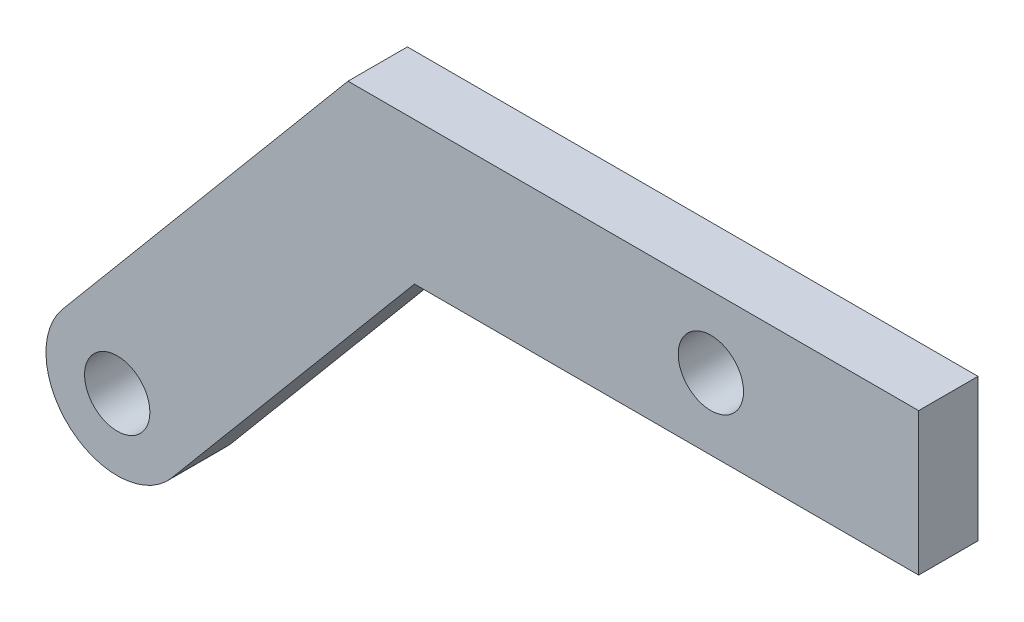
ISO-10303-21;
HEADER;
FILE_DESCRIPTION(('STEP AP214'),'2;1');
FILE_NAME('part.step','',(''),(''),'','','');
FILE_SCHEMA(('AUTOMOTIVE_DESIGN { 1 0 10303 214 1 1 1 1 }'));
ENDSEC;
DATA;
#1=APPLICATION_CONTEXT('core data for automotive mechanical design processes');
#2=APPLICATION_PROTOCOL_DEFINITION('international standard','automotive_design',2000,#1);
#3=PRODUCT_CONTEXT('',#1,'mechanical');
#4=PRODUCT('Part','Part','',(#3));
#5=PRODUCT_RELATED_PRODUCT_CATEGORY('part','',(#4));
#6=PRODUCT_DEFINITION_FORMATION('','',#4);
#7=PRODUCT_DEFINITION_CONTEXT('part definition',#1,'design');
#8=PRODUCT_DEFINITION('design','',#6,#7);
#9=PRODUCT_DEFINITION_SHAPE('','',#8);
#10=(LENGTH_UNIT() NAMED_UNIT(*) SI_UNIT(.MILLI.,.METRE.));
#11=(NAMED_UNIT(*) PLANE_ANGLE_UNIT() SI_UNIT($,.RADIAN.));
#12=(NAMED_UNIT(*) SI_UNIT($,.STERADIAN.) SOLID_ANGLE_UNIT());
#13=UNCERTAINTY_MEASURE_WITH_UNIT(LENGTH_MEASURE(1.E-05),#10,'distance_accuracy_value','');
#14=(GEOMETRIC_REPRESENTATION_CONTEXT(3) GLOBAL_UNCERTAINTY_ASSIGNED_CONTEXT((#13)) GLOBAL_UNIT_ASSIGNED_CONTEXT((#10,
#11,#12)) REPRESENTATION_CONTEXT('',''));
#15=CARTESIAN_POINT('',(0.,0.,0.));
#16=DIRECTION('',(0.,0.,1.));
#17=DIRECTION('',(1.,0.,0.));
#18=AXIS2_PLACEMENT_3D('',#15,#16,#17);
#19=CARTESIAN_POINT('',(0.,0.,10.));
#20=DIRECTION('',(0.,0.,1.));
#21=DIRECTION('',(1.,0.,0.));
#22=AXIS2_PLACEMENT_3D('',#19,#20,#21);
#23=PLANE('',#22);
#24=CARTESIAN_POINT('',(0.,0.,10.));
#25=DIRECTION('',(0.,0.,1.));
#26=DIRECTION('',(1.,0.,0.));
#27=AXIS2_PLACEMENT_3D('',#24,#25,#26);
#28=CIRCLE('',#27,5.5);
#29=CARTESIAN_POINT('',(5.5,0.,10.));
#30=VERTEX_POINT('',#29);
#31=EDGE_CURVE('E138',#30,#30,#28,.T.);
#32=ORIENTED_EDGE('',*,*,#31,.F.);
#33=EDGE_LOOP('',(#32));
#34=FACE_BOUND('',#33,.T.);
#35=CARTESIAN_POINT('',(0.,0.,10.));
#36=DIRECTION('',(0.,0.,1.));
#37=DIRECTION('',(1.,0.,0.));
#38=AXIS2_PLACEMENT_3D('',#35,#36,#37);
#39=CIRCLE('',#38,12.);
#40=CARTESIAN_POINT('',(-9.19253331742769,7.71345131623852,10.));
#41=VERTEX_POINT('',#40);
#42=CARTESIAN_POINT('',(9.19253331742769,-7.71345131623852,10.));
#43=VERTEX_POINT('',#42);
#44=EDGE_CURVE('E155',#41,#43,#39,.T.);
#45=ORIENTED_EDGE('',*,*,#44,.T.);
#46=DIRECTION('',(0.642787609686543,0.766044443118975,0.));
#47=VECTOR('',#46,1.);
#48=CARTESIAN_POINT('',(50.0679723502562,41.,10.));
#49=LINE('',#48,#47);
#50=CARTESIAN_POINT('',(50.0679723502562,41.,10.));
#51=VERTEX_POINT('',#50);
#52=EDGE_CURVE('E99',#43,#51,#49,.T.);
#53=ORIENTED_EDGE('',*,*,#52,.T.);
#54=DIRECTION('',(1.,0.,0.));
#55=VECTOR('',#54,1.);
#56=CARTESIAN_POINT('',(135.,41.,10.));
#57=LINE('',#56,#55);
#58=CARTESIAN_POINT('',(135.,41.,10.));
#59=VERTEX_POINT('',#58);
#60=EDGE_CURVE('E114',#51,#59,#57,.T.);
#61=ORIENTED_EDGE('',*,*,#60,.T.);
#62=DIRECTION('',(0.,1.,0.));
#63=VECTOR('',#62,1.);
#64=CARTESIAN_POINT('',(135.,65.,10.));
#65=LINE('',#64,#63);
#66=CARTESIAN_POINT('',(135.,65.,10.));
#67=VERTEX_POINT('',#66);
#68=EDGE_CURVE('E110',#59,#67,#65,.T.);
#69=ORIENTED_EDGE('',*,*,#68,.T.);
#70=DIRECTION('',(-1.,0.,0.));
#71=VECTOR('',#70,1.);
#72=CARTESIAN_POINT('',(38.8765885545364,65.,10.));
#73=LINE('',#72,#71);
#74=CARTESIAN_POINT('',(38.8765885545364,65.,10.));
#75=VERTEX_POINT('',#74);
#76=EDGE_CURVE('E112',#67,#75,#73,.T.);
#77=ORIENTED_EDGE('',*,*,#76,.T.);
#78=DIRECTION('',(-0.642787609686543,-0.766044443118975,0.));
#79=VECTOR('',#78,1.);
#80=CARTESIAN_POINT('',(-9.19253331742769,7.71345131623852,10.));
#81=LINE('',#80,#79);
#82=EDGE_CURVE('E64',#75,#41,#81,.T.);
#83=ORIENTED_EDGE('',*,*,#82,.T.);
#84=EDGE_LOOP('',(#45,#53,#61,#69,#77,#83));
#85=FACE_BOUND('',#84,.T.);
#86=CARTESIAN_POINT('',(100.,53.,10.));
#87=DIRECTION('',(0.,0.,1.));
#88=DIRECTION('',(1.,0.,0.));
#89=AXIS2_PLACEMENT_3D('',#86,#87,#88);
#90=CIRCLE('',#89,5.5);
#91=CARTESIAN_POINT('',(105.5,53.,10.));
#92=VERTEX_POINT('',#91);
#93=EDGE_CURVE('E196',#92,#92,#90,.T.);
#94=ORIENTED_EDGE('',*,*,#93,.F.);
#95=EDGE_LOOP('',(#94));
#96=FACE_BOUND('',#95,.T.);
#97=ADVANCED_FACE('F44',(#34,#85,#96),#23,.T.);
#98=CARTESIAN_POINT('',(0.,0.,0.));
#99=DIRECTION('',(0.,0.,1.));
#100=DIRECTION('',(1.,0.,0.));
#101=AXIS2_PLACEMENT_3D('',#98,#99,#100);
#102=PLANE('',#101);
#103=CARTESIAN_POINT('',(0.,0.,0.));
#104=DIRECTION('',(0.,0.,1.));
#105=DIRECTION('',(1.,0.,0.));
#106=AXIS2_PLACEMENT_3D('',#103,#104,#105);
#107=CIRCLE('',#106,12.);
#108=CARTESIAN_POINT('',(-9.19253331742769,7.71345131623852,0.));
#109=VERTEX_POINT('',#108);
#110=CARTESIAN_POINT('',(9.19253331742769,-7.71345131623852,0.));
#111=VERTEX_POINT('',#110);
#112=EDGE_CURVE('E133',#109,#111,#107,.T.);
#113=ORIENTED_EDGE('',*,*,#112,.F.);
#114=DIRECTION('',(-0.642787609686543,-0.766044443118975,0.));
#115=VECTOR('',#114,1.);
#116=CARTESIAN_POINT('',(-9.19253331742769,7.71345131623852,0.));
#117=LINE('',#116,#115);
#118=CARTESIAN_POINT('',(38.8765885545364,65.,0.));
#119=VERTEX_POINT('',#118);
#120=EDGE_CURVE('E95',#119,#109,#117,.T.);
#121=ORIENTED_EDGE('',*,*,#120,.F.);
#122=DIRECTION('',(-1.,0.,0.));
#123=VECTOR('',#122,1.);
#124=CARTESIAN_POINT('',(38.8765885545364,65.,0.));
#125=LINE('',#124,#123);
#126=CARTESIAN_POINT('',(135.,65.,0.));
#127=VERTEX_POINT('',#126);
#128=EDGE_CURVE('E88',#127,#119,#125,.T.);
#129=ORIENTED_EDGE('',*,*,#128,.F.);
#130=DIRECTION('',(0.,1.,0.));
#131=VECTOR('',#130,1.);
#132=CARTESIAN_POINT('',(135.,65.,0.));
#133=LINE('',#132,#131);
#134=CARTESIAN_POINT('',(135.,41.,0.));
#135=VERTEX_POINT('',#134);
#136=EDGE_CURVE('E124',#135,#127,#133,.T.);
#137=ORIENTED_EDGE('',*,*,#136,.F.);
#138=DIRECTION('',(1.,0.,0.));
#139=VECTOR('',#138,1.);
#140=CARTESIAN_POINT('',(135.,41.,0.));
#141=LINE('',#140,#139);
#142=CARTESIAN_POINT('',(50.0679723502562,41.,0.));
#143=VERTEX_POINT('',#142);
#144=EDGE_CURVE('E141',#143,#135,#141,.T.);
#145=ORIENTED_EDGE('',*,*,#144,.F.);
#146=DIRECTION('',(0.642787609686543,0.766044443118975,0.));
#147=VECTOR('',#146,1.);
#148=CARTESIAN_POINT('',(50.0679723502562,41.,0.));
#149=LINE('',#148,#147);
#150=EDGE_CURVE('E136',#111,#143,#149,.T.);
#151=ORIENTED_EDGE('',*,*,#150,.F.);
#152=EDGE_LOOP('',(#113,#121,#129,#137,#145,#151));
#153=FACE_BOUND('',#152,.T.);
#154=CARTESIAN_POINT('',(0.,0.,0.));
#155=DIRECTION('',(0.,0.,1.));
#156=DIRECTION('',(1.,0.,0.));
#157=AXIS2_PLACEMENT_3D('',#154,#155,#156);
#158=CIRCLE('',#157,5.5);
#159=CARTESIAN_POINT('',(5.5,0.,0.));
#160=VERTEX_POINT('',#159);
#161=EDGE_CURVE('E206',#160,#160,#158,.T.);
#162=ORIENTED_EDGE('',*,*,#161,.T.);
#163=EDGE_LOOP('',(#162));
#164=FACE_BOUND('',#163,.T.);
#165=CARTESIAN_POINT('',(100.,53.,0.));
#166=DIRECTION('',(0.,0.,1.));
#167=DIRECTION('',(1.,0.,0.));
#168=AXIS2_PLACEMENT_3D('',#165,#166,#167);
#169=CIRCLE('',#168,5.5);
#170=CARTESIAN_POINT('',(105.5,53.,0.));
#171=VERTEX_POINT('',#170);
#172=EDGE_CURVE('E203',#171,#171,#169,.T.);
#173=ORIENTED_EDGE('',*,*,#172,.T.);
#174=EDGE_LOOP('',(#173));
#175=FACE_BOUND('',#174,.T.);
#176=ADVANCED_FACE('F164',(#153,#164,#175),#102,.F.);
#177=CARTESIAN_POINT('',(0.,0.,10.));
#178=DIRECTION('',(0.,0.,-1.));
#179=DIRECTION('',(-1.,0.,0.));
#180=AXIS2_PLACEMENT_3D('',#177,#178,#179);
#181=CYLINDRICAL_SURFACE('',#180,12.);
#182=ORIENTED_EDGE('',*,*,#112,.T.);
#183=DIRECTION('',(0.,0.,-1.));
#184=VECTOR('',#183,1.);
#185=CARTESIAN_POINT('',(9.19253331742769,-7.71345131623852,10.));
#186=LINE('',#185,#184);
#187=EDGE_CURVE('E11',#43,#111,#186,.T.);
#188=ORIENTED_EDGE('',*,*,#187,.F.);
#189=ORIENTED_EDGE('',*,*,#44,.F.);
#190=DIRECTION('',(0.,0.,-1.));
#191=VECTOR('',#190,1.);
#192=CARTESIAN_POINT('',(-9.19253331742769,7.71345131623852,10.));
#193=LINE('',#192,#191);
#194=EDGE_CURVE('E132',#41,#109,#193,.T.);
#195=ORIENTED_EDGE('',*,*,#194,.T.);
#196=EDGE_LOOP('',(#182,#188,#189,#195));
#197=FACE_BOUND('',#196,.T.);
#198=ADVANCED_FACE('F50',(#197),#181,.T.);
#199=CARTESIAN_POINT('',(50.0679723502562,41.,10.));
#200=DIRECTION('',(-0.766044443118975,0.642787609686543,0.));
#201=DIRECTION('',(-0.642787609686543,-0.766044443118975,0.));
#202=AXIS2_PLACEMENT_3D('',#199,#200,#201);
#203=PLANE('',#202);
#204=ORIENTED_EDGE('',*,*,#150,.T.);
#205=DIRECTION('',(0.,0.,-1.));
#206=VECTOR('',#205,1.);
#207=CARTESIAN_POINT('',(50.0679723502562,41.,10.));
#208=LINE('',#207,#206);
#209=EDGE_CURVE('E54',#51,#143,#208,.T.);
#210=ORIENTED_EDGE('',*,*,#209,.F.);
#211=ORIENTED_EDGE('',*,*,#52,.F.);
#212=ORIENTED_EDGE('',*,*,#187,.T.);
#213=EDGE_LOOP('',(#204,#210,#211,#212));
#214=FACE_BOUND('',#213,.T.);
#215=ADVANCED_FACE('F255',(#214),#203,.F.);
#216=CARTESIAN_POINT('',(135.,41.,10.));
#217=DIRECTION('',(0.,1.,0.));
#218=DIRECTION('',(-1.,0.,0.));
#219=AXIS2_PLACEMENT_3D('',#216,#217,#218);
#220=PLANE('',#219);
#221=ORIENTED_EDGE('',*,*,#144,.T.);
#222=DIRECTION('',(0.,0.,-1.));
#223=VECTOR('',#222,1.);
#224=CARTESIAN_POINT('',(135.,41.,10.));
#225=LINE('',#224,#223);
#226=EDGE_CURVE('E121',#59,#135,#225,.T.);
#227=ORIENTED_EDGE('',*,*,#226,.F.);
#228=ORIENTED_EDGE('',*,*,#60,.F.);
#229=ORIENTED_EDGE('',*,*,#209,.T.);
#230=EDGE_LOOP('',(#221,#227,#228,#229));
#231=FACE_BOUND('',#230,.T.);
#232=ADVANCED_FACE('F165',(#231),#220,.F.);
#233=CARTESIAN_POINT('',(135.,65.,10.));
#234=DIRECTION('',(-1.,0.,0.));
#235=DIRECTION('',(0.,0.,1.));
#236=AXIS2_PLACEMENT_3D('',#233,#234,#235);
#237=PLANE('',#236);
#238=ORIENTED_EDGE('',*,*,#136,.T.);
#239=DIRECTION('',(0.,0.,-1.));
#240=VECTOR('',#239,1.);
#241=CARTESIAN_POINT('',(135.,65.,10.));
#242=LINE('',#241,#240);
#243=EDGE_CURVE('E116',#67,#127,#242,.T.);
#244=ORIENTED_EDGE('',*,*,#243,.F.);
#245=ORIENTED_EDGE('',*,*,#68,.F.);
#246=ORIENTED_EDGE('',*,*,#226,.T.);
#247=EDGE_LOOP('',(#238,#244,#245,#246));
#248=FACE_BOUND('',#247,.T.);
#249=ADVANCED_FACE('F118',(#248),#237,.F.);
#250=CARTESIAN_POINT('',(38.8765885545364,65.,10.));
#251=DIRECTION('',(0.,-1.,0.));
#252=DIRECTION('',(0.,0.,-1.));
#253=AXIS2_PLACEMENT_3D('',#250,#251,#252);
#254=PLANE('',#253);
#255=ORIENTED_EDGE('',*,*,#128,.T.);
#256=DIRECTION('',(0.,0.,-1.));
#257=VECTOR('',#256,1.);
#258=CARTESIAN_POINT('',(38.8765885545364,65.,10.));
#259=LINE('',#258,#257);
#260=EDGE_CURVE('E123',#75,#119,#259,.T.);
#261=ORIENTED_EDGE('',*,*,#260,.F.);
#262=ORIENTED_EDGE('',*,*,#76,.F.);
#263=ORIENTED_EDGE('',*,*,#243,.T.);
#264=EDGE_LOOP('',(#255,#261,#262,#263));
#265=FACE_BOUND('',#264,.T.);
#266=ADVANCED_FACE('F130',(#265),#254,.F.);
#267=CARTESIAN_POINT('',(-9.19253331742769,7.71345131623852,10.));
#268=DIRECTION('',(0.766044443118975,-0.642787609686543,0.));
#269=DIRECTION('',(0.642787609686543,0.766044443118975,0.));
#270=AXIS2_PLACEMENT_3D('',#267,#268,#269);
#271=PLANE('',#270);
#272=ORIENTED_EDGE('',*,*,#120,.T.);
#273=ORIENTED_EDGE('',*,*,#194,.F.);
#274=ORIENTED_EDGE('',*,*,#82,.F.);
#275=ORIENTED_EDGE('',*,*,#260,.T.);
#276=EDGE_LOOP('',(#272,#273,#274,#275));
#277=FACE_BOUND('',#276,.T.);
#278=ADVANCED_FACE('F168',(#277),#271,.F.);
#279=CARTESIAN_POINT('',(0.,0.,10.));
#280=DIRECTION('',(0.,0.,-1.));
#281=DIRECTION('',(-1.,0.,0.));
#282=AXIS2_PLACEMENT_3D('',#279,#280,#281);
#283=CYLINDRICAL_SURFACE('',#282,5.5);
#284=ORIENTED_EDGE('',*,*,#31,.T.);
#285=EDGE_LOOP('',(#284));
#286=FACE_BOUND('',#285,.T.);
#287=ORIENTED_EDGE('',*,*,#161,.F.);
#288=EDGE_LOOP('',(#287));
#289=FACE_BOUND('',#288,.T.);
#290=ADVANCED_FACE('F175',(#286,#289),#283,.F.);
#291=CARTESIAN_POINT('',(100.,53.,10.));
#292=DIRECTION('',(0.,0.,-1.));
#293=DIRECTION('',(-1.,0.,0.));
#294=AXIS2_PLACEMENT_3D('',#291,#292,#293);
#295=CYLINDRICAL_SURFACE('',#294,5.5);
#296=ORIENTED_EDGE('',*,*,#93,.T.);
#297=EDGE_LOOP('',(#296));
#298=FACE_BOUND('',#297,.T.);
#299=ORIENTED_EDGE('',*,*,#172,.F.);
#300=EDGE_LOOP('',(#299));
#301=FACE_BOUND('',#300,.T.);
#302=ADVANCED_FACE('F180',(#298,#301),#295,.F.);
#303=CLOSED_SHELL('',(#97,#176,#198,#215,#232,#249,#266,#278,#290,#302));
#304=MANIFOLD_SOLID_BREP('B2',#303);
#305=ADVANCED_BREP_SHAPE_REPRESENTATION('',(#18,#304),#14);
#306=SHAPE_DEFINITION_REPRESENTATION(#9,#305);
ENDSEC;
END-ISO-10303-21;
